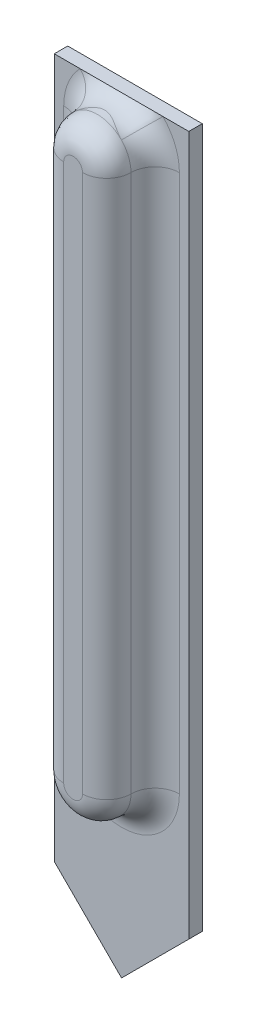
ISO-10303-21;
HEADER;
FILE_DESCRIPTION(('STEP AP214'),'2;1');
FILE_NAME('part.step','',(''),(''),'','','');
FILE_SCHEMA(('AUTOMOTIVE_DESIGN { 1 0 10303 214 1 1 1 1 }'));
ENDSEC;
DATA;
#1=APPLICATION_CONTEXT('core data for automotive mechanical design processes');
#2=APPLICATION_PROTOCOL_DEFINITION('international standard','automotive_design',2000,#1);
#3=PRODUCT_CONTEXT('',#1,'mechanical');
#4=PRODUCT('Part','Part','',(#3));
#5=PRODUCT_RELATED_PRODUCT_CATEGORY('part','',(#4));
#6=PRODUCT_DEFINITION_FORMATION('','',#4);
#7=PRODUCT_DEFINITION_CONTEXT('part definition',#1,'design');
#8=PRODUCT_DEFINITION('design','',#6,#7);
#9=PRODUCT_DEFINITION_SHAPE('','',#8);
#10=(LENGTH_UNIT() NAMED_UNIT(*) SI_UNIT(.MILLI.,.METRE.));
#11=(NAMED_UNIT(*) PLANE_ANGLE_UNIT() SI_UNIT($,.RADIAN.));
#12=(NAMED_UNIT(*) SI_UNIT($,.STERADIAN.) SOLID_ANGLE_UNIT());
#13=UNCERTAINTY_MEASURE_WITH_UNIT(LENGTH_MEASURE(1.E-05),#10,'distance_accuracy_value','');
#14=(GEOMETRIC_REPRESENTATION_CONTEXT(3) GLOBAL_UNCERTAINTY_ASSIGNED_CONTEXT((#13)) GLOBAL_UNIT_ASSIGNED_CONTEXT((#10,
#11,#12)) REPRESENTATION_CONTEXT('',''));
#15=CARTESIAN_POINT('',(0.,0.,0.));
#16=DIRECTION('',(0.,0.,1.));
#17=DIRECTION('',(1.,0.,0.));
#18=AXIS2_PLACEMENT_3D('',#15,#16,#17);
#19=CARTESIAN_POINT('',(0.,5.4,0.46));
#20=DIRECTION('',(0.,0.,1.));
#21=DIRECTION('',(1.,0.,0.));
#22=AXIS2_PLACEMENT_3D('',#19,#20,#21);
#23=PLANE('',#22);
#24=DIRECTION('',(0.,-1.,0.));
#25=VECTOR('',#24,1.);
#26=CARTESIAN_POINT('',(0.0699999999999997,5.4,0.46));
#27=LINE('',#26,#25);
#28=CARTESIAN_POINT('',(0.0700000000000002,5.4,0.46));
#29=VERTEX_POINT('',#28);
#30=CARTESIAN_POINT('',(0.07,1.4,0.46));
#31=VERTEX_POINT('',#30);
#32=EDGE_CURVE('E190',#29,#31,#27,.T.);
#33=ORIENTED_EDGE('',*,*,#32,.F.);
#34=CARTESIAN_POINT('',(0.,5.4,0.46));
#35=DIRECTION('',(0.,0.,-1.));
#36=DIRECTION('',(-1.,0.,0.));
#37=AXIS2_PLACEMENT_3D('',#34,#35,#36);
#38=CIRCLE('',#37,0.0700000000000015);
#39=CARTESIAN_POINT('',(-0.070000000000002,5.4,0.46));
#40=VERTEX_POINT('',#39);
#41=EDGE_CURVE('E176',#40,#29,#38,.T.);
#42=ORIENTED_EDGE('',*,*,#41,.F.);
#43=DIRECTION('',(0.,1.,0.));
#44=VECTOR('',#43,1.);
#45=CARTESIAN_POINT('',(-0.0700000000000034,5.4,0.46));
#46=LINE('',#45,#44);
#47=CARTESIAN_POINT('',(-0.0700000000000008,1.4,0.46));
#48=VERTEX_POINT('',#47);
#49=EDGE_CURVE('E172',#48,#40,#46,.T.);
#50=ORIENTED_EDGE('',*,*,#49,.F.);
#51=CARTESIAN_POINT('',(0.,1.4,0.46));
#52=DIRECTION('',(0.,0.,-1.));
#53=DIRECTION('',(1.,0.,0.));
#54=AXIS2_PLACEMENT_3D('',#51,#52,#53);
#55=CIRCLE('',#54,0.0699999999999999);
#56=EDGE_CURVE('E159',#48,#31,#55,.F.);
#57=ORIENTED_EDGE('',*,*,#56,.T.);
#58=EDGE_LOOP('',(#33,#42,#50,#57));
#59=FACE_BOUND('',#58,.T.);
#60=ADVANCED_FACE('F16',(#59),#23,.T.);
#61=CARTESIAN_POINT('',(-0.0700000000000034,5.4,0.28));
#62=DIRECTION('',(0.,1.,0.));
#63=DIRECTION('',(-1.,0.,0.));
#64=AXIS2_PLACEMENT_3D('',#61,#62,#63);
#65=CYLINDRICAL_SURFACE('',#64,0.18);
#66=DIRECTION('',(0.,-1.,0.));
#67=VECTOR('',#66,1.);
#68=CARTESIAN_POINT('',(-0.250000000000001,0.,0.28));
#69=LINE('',#68,#67);
#70=CARTESIAN_POINT('',(-0.250000000000002,5.4,0.28));
#71=VERTEX_POINT('',#70);
#72=CARTESIAN_POINT('',(-0.250000000000001,1.4,0.28));
#73=VERTEX_POINT('',#72);
#74=EDGE_CURVE('E184',#71,#73,#69,.T.);
#75=ORIENTED_EDGE('',*,*,#74,.T.);
#76=CARTESIAN_POINT('',(-0.0700000000000007,1.4,0.28));
#77=DIRECTION('',(0.,-1.,0.));
#78=DIRECTION('',(-1.,0.,0.));
#79=AXIS2_PLACEMENT_3D('',#76,#77,#78);
#80=CIRCLE('',#79,0.18);
#81=EDGE_CURVE('E169',#48,#73,#80,.T.);
#82=ORIENTED_EDGE('',*,*,#81,.F.);
#83=ORIENTED_EDGE('',*,*,#49,.T.);
#84=CARTESIAN_POINT('',(-0.0700000000000015,5.4,0.28));
#85=DIRECTION('',(0.,-1.,0.));
#86=DIRECTION('',(-1.,0.,0.));
#87=AXIS2_PLACEMENT_3D('',#84,#85,#86);
#88=CIRCLE('',#87,0.18);
#89=EDGE_CURVE('E180',#71,#40,#88,.F.);
#90=ORIENTED_EDGE('',*,*,#89,.F.);
#91=EDGE_LOOP('',(#75,#82,#83,#90));
#92=FACE_BOUND('',#91,.T.);
#93=ADVANCED_FACE('F182',(#92),#65,.T.);
#94=CARTESIAN_POINT('',(0.0700000000000015,5.4,0.28));
#95=DIRECTION('',(0.,1.,0.));
#96=DIRECTION('',(1.,0.,0.));
#97=AXIS2_PLACEMENT_3D('',#94,#95,#96);
#98=CIRCLE('',#97,0.18);
#99=TRIMMED_CURVE('',#98,(PARAMETER_VALUE(-1.9702215666755)),(PARAMETER_VALUE(1.9702215666755)),
.T.,.PARAMETER.);
#100=CARTESIAN_POINT('',(0.,5.4,0.28));
#101=DIRECTION('',(0.,0.,1.));
#102=AXIS1_PLACEMENT('',#100,#101);
#103=SURFACE_OF_REVOLUTION('',#99,#102);
#104=ORIENTED_EDGE('',*,*,#41,.T.);
#105=CARTESIAN_POINT('',(0.0699999999999997,5.4,0.28));
#106=DIRECTION('',(0.,-1.,0.));
#107=DIRECTION('',(1.,0.,0.));
#108=AXIS2_PLACEMENT_3D('',#105,#106,#107);
#109=CIRCLE('',#108,0.18);
#110=CARTESIAN_POINT('',(0.25,5.4,0.28));
#111=VERTEX_POINT('',#110);
#112=EDGE_CURVE('E201',#111,#29,#109,.T.);
#113=ORIENTED_EDGE('',*,*,#112,.F.);
#114=CARTESIAN_POINT('',(0.,5.4,0.28));
#115=DIRECTION('',(0.,0.,1.));
#116=DIRECTION('',(1.,0.,0.));
#117=AXIS2_PLACEMENT_3D('',#114,#115,#116);
#118=CIRCLE('',#117,0.250000000000001);
#119=CARTESIAN_POINT('',(0.179103741869174,5.57441860465117,0.28));
#120=VERTEX_POINT('',#119);
#121=EDGE_CURVE('E252',#111,#120,#118,.T.);
#122=ORIENTED_EDGE('',*,*,#121,.T.);
#123=CARTESIAN_POINT('',(0.,5.4,0.28));
#124=DIRECTION('',(0.,0.,-1.));
#125=DIRECTION('',(-1.,0.,0.));
#126=AXIS2_PLACEMENT_3D('',#123,#124,#125);
#127=CIRCLE('',#126,0.250000000000001);
#128=CARTESIAN_POINT('',(-0.17910374186918,5.57441860465116,0.28));
#129=VERTEX_POINT('',#128);
#130=EDGE_CURVE('E186',#129,#120,#127,.T.);
#131=ORIENTED_EDGE('',*,*,#130,.F.);
#132=CARTESIAN_POINT('',(0.,5.4,0.28));
#133=DIRECTION('',(0.,0.,1.));
#134=DIRECTION('',(1.,0.,0.));
#135=AXIS2_PLACEMENT_3D('',#132,#133,#134);
#136=CIRCLE('',#135,0.250000000000001);
#137=EDGE_CURVE('E198',#129,#71,#136,.T.);
#138=ORIENTED_EDGE('',*,*,#137,.T.);
#139=ORIENTED_EDGE('',*,*,#89,.T.);
#140=EDGE_LOOP('',(#104,#113,#122,#131,#138,#139));
#141=FACE_BOUND('',#140,.T.);
#142=ADVANCED_FACE('F210',(#141),#103,.F.);
#143=CARTESIAN_POINT('',(0.0699999999999997,5.4,0.28));
#144=DIRECTION('',(0.,-1.,0.));
#145=DIRECTION('',(1.,0.,0.));
#146=AXIS2_PLACEMENT_3D('',#143,#144,#145);
#147=CYLINDRICAL_SURFACE('',#146,0.18);
#148=ORIENTED_EDGE('',*,*,#32,.T.);
#149=CARTESIAN_POINT('',(0.0700000000000007,1.4,0.28));
#150=DIRECTION('',(0.,1.,0.));
#151=DIRECTION('',(1.,0.,0.));
#152=AXIS2_PLACEMENT_3D('',#149,#150,#151);
#153=CIRCLE('',#152,0.18);
#154=CARTESIAN_POINT('',(0.25,1.4,0.28));
#155=VERTEX_POINT('',#154);
#156=EDGE_CURVE('E171',#155,#31,#153,.F.);
#157=ORIENTED_EDGE('',*,*,#156,.F.);
#158=DIRECTION('',(0.,1.,0.));
#159=VECTOR('',#158,1.);
#160=CARTESIAN_POINT('',(0.25,0.,0.28));
#161=LINE('',#160,#159);
#162=EDGE_CURVE('E250',#155,#111,#161,.T.);
#163=ORIENTED_EDGE('',*,*,#162,.T.);
#164=ORIENTED_EDGE('',*,*,#112,.T.);
#165=EDGE_LOOP('',(#148,#157,#163,#164));
#166=FACE_BOUND('',#165,.T.);
#167=ADVANCED_FACE('F214',(#166),#147,.T.);
#168=CARTESIAN_POINT('',(0.0700000000000007,1.4,0.28));
#169=DIRECTION('',(0.,1.,0.));
#170=DIRECTION('',(1.,0.,0.));
#171=AXIS2_PLACEMENT_3D('',#168,#169,#170);
#172=CIRCLE('',#171,0.18);
#173=TRIMMED_CURVE('',#172,(PARAMETER_VALUE(-1.9702215666755)),
(PARAMETER_VALUE(1.9702215666755)),.T.,.PARAMETER.);
#174=CARTESIAN_POINT('',(0.,1.4,0.28));
#175=DIRECTION('',(0.,0.,1.));
#176=AXIS1_PLACEMENT('',#174,#175);
#177=SURFACE_OF_REVOLUTION('',#173,#176);
#178=ORIENTED_EDGE('',*,*,#81,.T.);
#179=CARTESIAN_POINT('',(0.,1.4,0.28));
#180=DIRECTION('',(0.,0.,1.));
#181=DIRECTION('',(1.,0.,0.));
#182=AXIS2_PLACEMENT_3D('',#179,#180,#181);
#183=CIRCLE('',#182,0.250000000000001);
#184=EDGE_CURVE('E339',#73,#155,#183,.T.);
#185=ORIENTED_EDGE('',*,*,#184,.T.);
#186=ORIENTED_EDGE('',*,*,#156,.T.);
#187=ORIENTED_EDGE('',*,*,#56,.F.);
#188=EDGE_LOOP('',(#178,#185,#186,#187));
#189=FACE_BOUND('',#188,.T.);
#190=ADVANCED_FACE('F166',(#189),#177,.F.);
#191=CARTESIAN_POINT('',(0.,5.4,0.46));
#192=DIRECTION('',(0.,0.,-1.));
#193=DIRECTION('',(-1.,0.,0.));
#194=AXIS2_PLACEMENT_3D('',#191,#192,#193);
#195=CYLINDRICAL_SURFACE('',#194,0.250000000000001);
#196=ORIENTED_EDGE('',*,*,#130,.T.);
#197=CARTESIAN_POINT('',(-0.17910374186918,5.57441860465116,0.28));
#198=CARTESIAN_POINT('',(-0.155346806167557,5.59881368617367,0.27999954022219));
#199=CARTESIAN_POINT('',(-0.127244302039456,5.61765410443162,0.265939195851083));
#200=CARTESIAN_POINT('',(-0.0671254923551522,5.64301973140779,0.238360025353106));
#201=CARTESIAN_POINT('',(-0.0341213276340786,5.64999369309407,0.224510284251947));
#202=CARTESIAN_POINT('',(0.0340288461470066,5.65000629835311,0.224487723068687));
#203=CARTESIAN_POINT('',(0.0671266285470243,5.64302527002861,0.238359706539339));
#204=CARTESIAN_POINT('',(0.127321400700701,5.61761554874636,0.265975405936455));
#205=CARTESIAN_POINT('',(0.155388089068925,5.59877129435356,0.279999554675328));
#206=CARTESIAN_POINT('',(0.179103741869169,5.57441860465117,0.28));
#207=(BOUNDED_CURVE() B_SPLINE_CURVE(3,(#197,#198,#199,#200,#201,#202,#203,#204,#205,#206),
.UNSPECIFIED.,.F.,.F.) B_SPLINE_CURVE_WITH_KNOTS((4,2,2,2,4),(0.000308529946334535,
0.000483123963909765,0.000657717981484994,0.000832311999060223,0.00100690601663545),
.UNSPECIFIED.) CURVE() GEOMETRIC_REPRESENTATION_ITEM() RATIONAL_B_SPLINE_CURVE((1.,1.,1.,1.,1.,
1.,1.,1.,1.,1.)) REPRESENTATION_ITEM(''));
#208=EDGE_CURVE('E263',#120,#129,#207,.F.);
#209=ORIENTED_EDGE('',*,*,#208,.T.);
#210=EDGE_LOOP('',(#196,#209));
#211=FACE_BOUND('',#210,.T.);
#212=ADVANCED_FACE('F261',(#211),#195,.T.);
#213=CARTESIAN_POINT('',(-0.430000000000001,0.,0.28));
#214=DIRECTION('',(0.,-1.,0.));
#215=DIRECTION('',(1.,0.,0.));
#216=AXIS2_PLACEMENT_3D('',#213,#214,#215);
#217=CYLINDRICAL_SURFACE('',#216,0.18);
#218=DIRECTION('',(0.,1.,0.));
#219=VECTOR('',#218,1.);
#220=CARTESIAN_POINT('',(-0.430000000000001,0.,0.1));
#221=LINE('',#220,#219);
#222=CARTESIAN_POINT('',(-0.430000000000001,1.4,0.1));
#223=VERTEX_POINT('',#222);
#224=CARTESIAN_POINT('',(-0.430000000000003,5.4,0.1));
#225=VERTEX_POINT('',#224);
#226=EDGE_CURVE('E276',#223,#225,#221,.T.);
#227=ORIENTED_EDGE('',*,*,#226,.F.);
#228=CARTESIAN_POINT('',(-0.430000000000001,1.4,0.28));
#229=DIRECTION('',(0.,-1.,0.));
#230=DIRECTION('',(-1.,0.,0.));
#231=AXIS2_PLACEMENT_3D('',#228,#229,#230);
#232=CIRCLE('',#231,0.18);
#233=EDGE_CURVE('E342',#223,#73,#232,.T.);
#234=ORIENTED_EDGE('',*,*,#233,.T.);
#235=ORIENTED_EDGE('',*,*,#74,.F.);
#236=CARTESIAN_POINT('',(-0.430000000000001,5.4,0.28));
#237=DIRECTION('',(0.,-1.,0.));
#238=DIRECTION('',(-1.,0.,0.));
#239=AXIS2_PLACEMENT_3D('',#236,#237,#238);
#240=CIRCLE('',#239,0.18);
#241=EDGE_CURVE('E258',#71,#225,#240,.F.);
#242=ORIENTED_EDGE('',*,*,#241,.T.);
#243=EDGE_LOOP('',(#227,#234,#235,#242));
#244=FACE_BOUND('',#243,.T.);
#245=ADVANCED_FACE('F401',(#244),#217,.F.);
#246=CARTESIAN_POINT('',(0.,5.4,0.28));
#247=DIRECTION('',(0.,0.,1.));
#248=DIRECTION('',(1.,0.,0.));
#249=AXIS2_PLACEMENT_3D('',#246,#247,#248);
#250=TOROIDAL_SURFACE('',#249,0.430000000000001,0.18);
#251=CARTESIAN_POINT('',(0.,5.4,0.1));
#252=DIRECTION('',(0.,0.,1.));
#253=DIRECTION('',(-0.716414967476717,0.697674418604649,0.));
#254=AXIS2_PLACEMENT_3D('',#251,#252,#253);
#255=CIRCLE('',#254,0.430000000000002);
#256=CARTESIAN_POINT('',(-0.308058436014989,5.7,0.1));
#257=VERTEX_POINT('',#256);
#258=EDGE_CURVE('E373',#225,#257,#255,.F.);
#259=ORIENTED_EDGE('',*,*,#258,.F.);
#260=ORIENTED_EDGE('',*,*,#241,.F.);
#261=ORIENTED_EDGE('',*,*,#137,.F.);
#262=CARTESIAN_POINT('',(-0.308058436014988,5.7,0.28));
#263=DIRECTION('',(0.697674418604654,0.716414967476712,0.));
#264=DIRECTION('',(0.716414967476713,-0.697674418604653,0.));
#265=AXIS2_PLACEMENT_3D('',#262,#263,#264);
#266=CIRCLE('',#265,0.18);
#267=EDGE_CURVE('E277',#129,#257,#266,.T.);
#268=ORIENTED_EDGE('',*,*,#267,.T.);
#269=EDGE_LOOP('',(#259,#260,#261,#268));
#270=FACE_BOUND('',#269,.T.);
#271=ADVANCED_FACE('F355',(#270),#250,.F.);
#272=CARTESIAN_POINT('',(0.,5.4,0.28));
#273=DIRECTION('',(0.,0.,1.));
#274=DIRECTION('',(1.,0.,0.));
#275=AXIS2_PLACEMENT_3D('',#272,#273,#274);
#276=TOROIDAL_SURFACE('',#275,0.430000000000001,0.18);
#277=CARTESIAN_POINT('',(0.,5.4,0.1));
#278=DIRECTION('',(0.,0.,1.));
#279=DIRECTION('',(1.,0.,0.));
#280=AXIS2_PLACEMENT_3D('',#277,#278,#279);
#281=CIRCLE('',#280,0.430000000000002);
#282=CARTESIAN_POINT('',(0.308058436014987,5.7,0.0999999999999999));
#283=VERTEX_POINT('',#282);
#284=CARTESIAN_POINT('',(0.43,5.4,0.1));
#285=VERTEX_POINT('',#284);
#286=EDGE_CURVE('E270',#283,#285,#281,.F.);
#287=ORIENTED_EDGE('',*,*,#286,.F.);
#288=CARTESIAN_POINT('',(0.30805843601497,5.70000000000002,0.28));
#289=DIRECTION('',(-0.697674418604699,0.716414967476668,0.));
#290=DIRECTION('',(-0.716414967476668,-0.697674418604699,0.));
#291=AXIS2_PLACEMENT_3D('',#288,#289,#290);
#292=CIRCLE('',#291,0.18);
#293=EDGE_CURVE('E267',#283,#120,#292,.T.);
#294=ORIENTED_EDGE('',*,*,#293,.T.);
#295=ORIENTED_EDGE('',*,*,#121,.F.);
#296=CARTESIAN_POINT('',(0.43,5.4,0.28));
#297=DIRECTION('',(0.,1.,0.));
#298=DIRECTION('',(-1.,0.,0.));
#299=AXIS2_PLACEMENT_3D('',#296,#297,#298);
#300=CIRCLE('',#299,0.18);
#301=EDGE_CURVE('E344',#111,#285,#300,.F.);
#302=ORIENTED_EDGE('',*,*,#301,.T.);
#303=EDGE_LOOP('',(#287,#294,#295,#302));
#304=FACE_BOUND('',#303,.T.);
#305=ADVANCED_FACE('F268',(#304),#276,.F.);
#306=CARTESIAN_POINT('',(0.43,0.,0.28));
#307=DIRECTION('',(0.,1.,0.));
#308=DIRECTION('',(-1.,0.,0.));
#309=AXIS2_PLACEMENT_3D('',#306,#307,#308);
#310=CYLINDRICAL_SURFACE('',#309,0.18);
#311=ORIENTED_EDGE('',*,*,#162,.F.);
#312=CARTESIAN_POINT('',(0.430000000000001,1.4,0.28));
#313=DIRECTION('',(0.,1.,0.));
#314=DIRECTION('',(1.,0.,0.));
#315=AXIS2_PLACEMENT_3D('',#312,#313,#314);
#316=CIRCLE('',#315,0.18);
#317=CARTESIAN_POINT('',(0.430000000000001,1.4,0.1));
#318=VERTEX_POINT('',#317);
#319=EDGE_CURVE('E282',#155,#318,#316,.F.);
#320=ORIENTED_EDGE('',*,*,#319,.T.);
#321=DIRECTION('',(0.,1.,0.));
#322=VECTOR('',#321,1.);
#323=CARTESIAN_POINT('',(0.43,0.,0.1));
#324=LINE('',#323,#322);
#325=EDGE_CURVE('E412',#285,#318,#324,.F.);
#326=ORIENTED_EDGE('',*,*,#325,.F.);
#327=ORIENTED_EDGE('',*,*,#301,.F.);
#328=EDGE_LOOP('',(#311,#320,#326,#327));
#329=FACE_BOUND('',#328,.T.);
#330=ADVANCED_FACE('F315',(#329),#310,.F.);
#331=CARTESIAN_POINT('',(0.,1.4,0.28));
#332=DIRECTION('',(0.,0.,1.));
#333=DIRECTION('',(1.,0.,0.));
#334=AXIS2_PLACEMENT_3D('',#331,#332,#333);
#335=TOROIDAL_SURFACE('',#334,0.430000000000001,0.18);
#336=ORIENTED_EDGE('',*,*,#184,.F.);
#337=ORIENTED_EDGE('',*,*,#233,.F.);
#338=CARTESIAN_POINT('',(0.,1.4,0.1));
#339=DIRECTION('',(0.,0.,1.));
#340=DIRECTION('',(-1.,0.,0.));
#341=AXIS2_PLACEMENT_3D('',#338,#339,#340);
#342=CIRCLE('',#341,0.430000000000001);
#343=EDGE_CURVE('E328',#318,#223,#342,.F.);
#344=ORIENTED_EDGE('',*,*,#343,.F.);
#345=ORIENTED_EDGE('',*,*,#319,.F.);
#346=EDGE_LOOP('',(#336,#337,#344,#345));
#347=FACE_BOUND('',#346,.T.);
#348=ADVANCED_FACE('F303',(#347),#335,.F.);
#349=CARTESIAN_POINT('',(0.179103741869169,5.57441860465117,0.28));
#350=CARTESIAN_POINT('',(0.179103741869179,5.57441860465116,0.100000000000014));
#351=CARTESIAN_POINT('',(0.30805843601497,5.7,0.1));
#352=CARTESIAN_POINT('',(0.155388089068925,5.59877129435356,0.279999554675328));
#353=CARTESIAN_POINT('',(0.1764137469796,5.57718207811373,0.128281540501433));
#354=CARTESIAN_POINT('',(0.267271783992285,5.7,0.1));
#355=CARTESIAN_POINT('',(0.127321400700701,5.61761554874636,0.265975405936455));
#356=CARTESIAN_POINT('',(0.154791727221271,5.60229152599031,0.144999845657445));
#357=CARTESIAN_POINT('',(0.218992810851991,5.7,0.100000000000001));
#358=CARTESIAN_POINT('',(0.0671266285470243,5.64302527002861,0.238359706539339));
#359=CARTESIAN_POINT('',(0.0889000534710502,5.63723045237553,0.154912521513229));
#360=CARTESIAN_POINT('',(0.115457799454096,5.7,0.0999999999999994));
#361=CARTESIAN_POINT('',(0.0340288461470066,5.65000629835311,0.224487723068687));
#362=CARTESIAN_POINT('',(0.0443022846662579,5.65001006690792,0.152207807841712));
#363=CARTESIAN_POINT('',(0.058529615379709,5.7,0.1));
#364=CARTESIAN_POINT('',(-0.0341213276340786,5.64999369309407,0.224510284251947));
#365=CARTESIAN_POINT('',(-0.0444247030658912,5.64998991891724,0.152210706955469));
#366=CARTESIAN_POINT('',(-0.058688683537473,5.7,0.1));
#367=CARTESIAN_POINT('',(-0.0671254923551522,5.64301973140779,0.238360025353106));
#368=CARTESIAN_POINT('',(-0.0888886736979652,5.63722831075006,0.154906029912478));
#369=CARTESIAN_POINT('',(-0.115455846078706,5.7,0.0999999999999994));
#370=CARTESIAN_POINT('',(-0.127244302039456,5.61765410443162,0.265939195851083));
#371=CARTESIAN_POINT('',(-0.154708984781072,5.6023443616075,0.145021284807547));
#372=CARTESIAN_POINT('',(-0.218860200280019,5.7,0.1));
#373=CARTESIAN_POINT('',(-0.155346806167557,5.59881368617367,0.27999954022219));
#374=CARTESIAN_POINT('',(-0.176408857335257,5.57718710782864,0.128332758834526));
#375=CARTESIAN_POINT('',(-0.267206351406332,5.7,0.1));
#376=CARTESIAN_POINT('',(-0.17910374186918,5.57441860465116,0.28));
#377=CARTESIAN_POINT('',(-0.17910374186918,5.57441860465116,0.100000000000001));
#378=CARTESIAN_POINT('',(-0.308058436014988,5.7,0.1));
#379=(BOUNDED_SURFACE() B_SPLINE_SURFACE(3,2,((#349,#350,#351),(#352,#353,#354),(#355,#356,
#357),(#358,#359,#360),(#361,#362,#363),(#364,#365,#366),(#367,#368,#369),(#370,#371,#372),
(#373,#374,#375),(#376,#377,#378)),.UNSPECIFIED.,.F.,.F.,.F.) B_SPLINE_SURFACE_WITH_KNOTS((4,2,
2,2,4),(3,3),(0.000308529946334535,0.000483123963909765,0.000657717981484994,
0.000832311999060223,0.00100690601663545),(0.,1.),
.UNSPECIFIED.) GEOMETRIC_REPRESENTATION_ITEM() RATIONAL_B_SPLINE_SURFACE(((1.,0.707106781186575,
1.),(1.,0.765345006797525,1.),(1.,0.823519548796732,1.),(1.,0.903977827565001,1.),(1.,
0.927981770905569,1.),(1.,0.927939654696627,1.),(1.,0.903962496694066,1.),(1.,0.823639429235469,
1.),(1.,0.765459439863177,1.),(1.,0.707106781186549,1.))) REPRESENTATION_ITEM('') SURFACE());
#380=DIRECTION('',(1.,0.,0.));
#381=VECTOR('',#380,1.);
#382=CARTESIAN_POINT('',(0.,5.7,0.1));
#383=LINE('',#382,#381);
#384=EDGE_CURVE('E445',#283,#257,#383,.F.);
#385=ORIENTED_EDGE('',*,*,#384,.T.);
#386=ORIENTED_EDGE('',*,*,#267,.F.);
#387=ORIENTED_EDGE('',*,*,#208,.F.);
#388=ORIENTED_EDGE('',*,*,#293,.F.);
#389=EDGE_LOOP('',(#385,#386,#387,#388));
#390=FACE_BOUND('',#389,.T.);
#391=ADVANCED_FACE('F281',(#390),#379,.F.);
#392=CARTESIAN_POINT('',(0.,0.,0.1));
#393=DIRECTION('',(0.,0.,1.));
#394=DIRECTION('',(1.,0.,0.));
#395=AXIS2_PLACEMENT_3D('',#392,#393,#394);
#396=PLANE('',#395);
#397=ORIENTED_EDGE('',*,*,#325,.T.);
#398=ORIENTED_EDGE('',*,*,#343,.T.);
#399=ORIENTED_EDGE('',*,*,#226,.T.);
#400=ORIENTED_EDGE('',*,*,#258,.T.);
#401=DIRECTION('',(1.,0.,0.));
#402=VECTOR('',#401,1.);
#403=CARTESIAN_POINT('',(0.,5.7,0.1));
#404=LINE('',#403,#402);
#405=CARTESIAN_POINT('',(-0.499999999999994,5.7,0.1));
#406=VERTEX_POINT('',#405);
#407=EDGE_CURVE('E447',#257,#406,#404,.F.);
#408=ORIENTED_EDGE('',*,*,#407,.T.);
#409=DIRECTION('',(0.,1.,0.));
#410=VECTOR('',#409,1.);
#411=CARTESIAN_POINT('',(-0.499999999999993,0.,0.1));
#412=LINE('',#411,#410);
#413=CARTESIAN_POINT('',(-0.499999999999993,0.499999999999995,0.1));
#414=VERTEX_POINT('',#413);
#415=EDGE_CURVE('E456',#406,#414,#412,.F.);
#416=ORIENTED_EDGE('',*,*,#415,.T.);
#417=DIRECTION('',(-0.707106781186546,0.707106781186549,0.));
#418=VECTOR('',#417,1.);
#419=CARTESIAN_POINT('',(0.,0.,0.1));
#420=LINE('',#419,#418);
#421=CARTESIAN_POINT('',(0.,0.,0.1));
#422=VERTEX_POINT('',#421);
#423=EDGE_CURVE('E600',#414,#422,#420,.F.);
#424=ORIENTED_EDGE('',*,*,#423,.T.);
#425=DIRECTION('',(-0.707106781186546,-0.707106781186549,0.));
#426=VECTOR('',#425,1.);
#427=CARTESIAN_POINT('',(0.,0.,0.1));
#428=LINE('',#427,#426);
#429=CARTESIAN_POINT('',(0.499999999999994,0.499999999999996,0.1));
#430=VERTEX_POINT('',#429);
#431=EDGE_CURVE('E603',#422,#430,#428,.F.);
#432=ORIENTED_EDGE('',*,*,#431,.T.);
#433=DIRECTION('',(0.,1.,0.));
#434=VECTOR('',#433,1.);
#435=CARTESIAN_POINT('',(0.499999999999994,0.,0.1));
#436=LINE('',#435,#434);
#437=CARTESIAN_POINT('',(0.499999999999994,5.7,0.1));
#438=VERTEX_POINT('',#437);
#439=EDGE_CURVE('E472',#430,#438,#436,.T.);
#440=ORIENTED_EDGE('',*,*,#439,.T.);
#441=DIRECTION('',(1.,0.,0.));
#442=VECTOR('',#441,1.);
#443=CARTESIAN_POINT('',(0.,5.7,0.1));
#444=LINE('',#443,#442);
#445=EDGE_CURVE('E417',#438,#283,#444,.F.);
#446=ORIENTED_EDGE('',*,*,#445,.T.);
#447=ORIENTED_EDGE('',*,*,#286,.T.);
#448=EDGE_LOOP('',(#397,#398,#399,#400,#408,#416,#424,#432,#440,#446,#447));
#449=FACE_BOUND('',#448,.T.);
#450=ADVANCED_FACE('F302',(#449),#396,.T.);
#451=CARTESIAN_POINT('',(-0.0700000000000034,5.4,0.28));
#452=DIRECTION('',(0.,1.,0.));
#453=DIRECTION('',(-1.,0.,0.));
#454=AXIS2_PLACEMENT_3D('',#451,#452,#453);
#455=CYLINDRICAL_SURFACE('',#454,0.08);
#456=CARTESIAN_POINT('',(-0.0700000000000015,1.4,0.28));
#457=DIRECTION('',(0.,1.,0.));
#458=DIRECTION('',(-1.,0.,0.));
#459=AXIS2_PLACEMENT_3D('',#456,#457,#458);
#460=CIRCLE('',#459,0.08);
#461=CARTESIAN_POINT('',(-0.150000000000001,1.4,0.28));
#462=VERTEX_POINT('',#461);
#463=CARTESIAN_POINT('',(-0.0700000000000012,1.4,0.36));
#464=VERTEX_POINT('',#463);
#465=EDGE_CURVE('E469',#462,#464,#460,.T.);
#466=ORIENTED_EDGE('',*,*,#465,.F.);
#467=DIRECTION('',(0.,-1.,0.));
#468=VECTOR('',#467,1.);
#469=CARTESIAN_POINT('',(-0.150000000000001,0.,0.28));
#470=LINE('',#469,#468);
#471=CARTESIAN_POINT('',(-0.150000000000002,5.4,0.28));
#472=VERTEX_POINT('',#471);
#473=EDGE_CURVE('E477',#472,#462,#470,.T.);
#474=ORIENTED_EDGE('',*,*,#473,.F.);
#475=CARTESIAN_POINT('',(-0.0700000000000015,5.4,0.28));
#476=DIRECTION('',(0.,-1.,0.));
#477=DIRECTION('',(-1.,0.,0.));
#478=AXIS2_PLACEMENT_3D('',#475,#476,#477);
#479=CIRCLE('',#478,0.08);
#480=CARTESIAN_POINT('',(-0.0700000000000015,5.4,0.36));
#481=VERTEX_POINT('',#480);
#482=EDGE_CURVE('E486',#472,#481,#479,.F.);
#483=ORIENTED_EDGE('',*,*,#482,.T.);
#484=DIRECTION('',(0.,1.,0.));
#485=VECTOR('',#484,1.);
#486=CARTESIAN_POINT('',(-0.0700000000000015,5.4,0.36));
#487=LINE('',#486,#485);
#488=EDGE_CURVE('E544',#481,#464,#487,.F.);
#489=ORIENTED_EDGE('',*,*,#488,.T.);
#490=EDGE_LOOP('',(#466,#474,#483,#489));
#491=FACE_BOUND('',#490,.T.);
#492=ADVANCED_FACE('F750',(#491),#455,.F.);
#493=CARTESIAN_POINT('',(0.,5.7,0.1));
#494=DIRECTION('',(0.,-1.,0.));
#495=DIRECTION('',(0.,0.,-1.));
#496=AXIS2_PLACEMENT_3D('',#493,#494,#495);
#497=PLANE('',#496);
#498=DIRECTION('',(0.,0.,1.));
#499=VECTOR('',#498,1.);
#500=CARTESIAN_POINT('',(-0.499999999999994,5.7,0.1));
#501=LINE('',#500,#499);
#502=CARTESIAN_POINT('',(-0.499999999999994,5.7,0.));
#503=VERTEX_POINT('',#502);
#504=EDGE_CURVE('E451',#503,#406,#501,.T.);
#505=ORIENTED_EDGE('',*,*,#504,.T.);
#506=ORIENTED_EDGE('',*,*,#407,.F.);
#507=ORIENTED_EDGE('',*,*,#384,.F.);
#508=ORIENTED_EDGE('',*,*,#445,.F.);
#509=DIRECTION('',(0.,0.,1.));
#510=VECTOR('',#509,1.);
#511=CARTESIAN_POINT('',(0.499999999999994,5.7,0.1));
#512=LINE('',#511,#510);
#513=CARTESIAN_POINT('',(0.499999999999994,5.7,0.));
#514=VERTEX_POINT('',#513);
#515=EDGE_CURVE('E474',#438,#514,#512,.F.);
#516=ORIENTED_EDGE('',*,*,#515,.T.);
#517=DIRECTION('',(1.,0.,0.));
#518=VECTOR('',#517,1.);
#519=CARTESIAN_POINT('',(0.,5.7,0.));
#520=LINE('',#519,#518);
#521=EDGE_CURVE('E593',#514,#503,#520,.F.);
#522=ORIENTED_EDGE('',*,*,#521,.T.);
#523=EDGE_LOOP('',(#505,#506,#507,#508,#516,#522));
#524=FACE_BOUND('',#523,.T.);
#525=ADVANCED_FACE('F589',(#524),#497,.F.);
#526=CARTESIAN_POINT('',(-0.499999999999993,0.,0.1));
#527=DIRECTION('',(1.,0.,0.));
#528=DIRECTION('',(0.,1.,0.));
#529=AXIS2_PLACEMENT_3D('',#526,#527,#528);
#530=PLANE('',#529);
#531=DIRECTION('',(0.,0.,1.));
#532=VECTOR('',#531,1.);
#533=CARTESIAN_POINT('',(-0.499999999999993,0.499999999999995,0.1));
#534=LINE('',#533,#532);
#535=CARTESIAN_POINT('',(-0.499999999999993,0.499999999999995,0.));
#536=VERTEX_POINT('',#535);
#537=EDGE_CURVE('E460',#536,#414,#534,.T.);
#538=ORIENTED_EDGE('',*,*,#537,.T.);
#539=ORIENTED_EDGE('',*,*,#415,.F.);
#540=ORIENTED_EDGE('',*,*,#504,.F.);
#541=DIRECTION('',(0.,1.,0.));
#542=VECTOR('',#541,1.);
#543=CARTESIAN_POINT('',(-0.499999999999994,0.,0.));
#544=LINE('',#543,#542);
#545=EDGE_CURVE('E719',#503,#536,#544,.F.);
#546=ORIENTED_EDGE('',*,*,#545,.T.);
#547=EDGE_LOOP('',(#538,#539,#540,#546));
#548=FACE_BOUND('',#547,.T.);
#549=ADVANCED_FACE('F597',(#548),#530,.F.);
#550=CARTESIAN_POINT('',(0.,0.,0.1));
#551=DIRECTION('',(0.707106781186549,0.707106781186546,0.));
#552=DIRECTION('',(-0.707106781186546,0.707106781186549,0.));
#553=AXIS2_PLACEMENT_3D('',#550,#551,#552);
#554=PLANE('',#553);
#555=DIRECTION('',(0.,0.,1.));
#556=VECTOR('',#555,1.);
#557=CARTESIAN_POINT('',(0.,0.,0.1));
#558=LINE('',#557,#556);
#559=CARTESIAN_POINT('',(0.,0.,0.));
#560=VERTEX_POINT('',#559);
#561=EDGE_CURVE('E606',#560,#422,#558,.T.);
#562=ORIENTED_EDGE('',*,*,#561,.T.);
#563=ORIENTED_EDGE('',*,*,#423,.F.);
#564=ORIENTED_EDGE('',*,*,#537,.F.);
#565=DIRECTION('',(0.707106781186546,-0.707106781186549,0.));
#566=VECTOR('',#565,1.);
#567=CARTESIAN_POINT('',(-0.499999999999993,0.499999999999995,0.));
#568=LINE('',#567,#566);
#569=EDGE_CURVE('E610',#536,#560,#568,.T.);
#570=ORIENTED_EDGE('',*,*,#569,.T.);
#571=EDGE_LOOP('',(#562,#563,#564,#570));
#572=FACE_BOUND('',#571,.T.);
#573=ADVANCED_FACE('F608',(#572),#554,.F.);
#574=CARTESIAN_POINT('',(0.,0.,0.1));
#575=DIRECTION('',(-0.707106781186549,0.707106781186546,0.));
#576=DIRECTION('',(-0.707106781186546,-0.707106781186549,0.));
#577=AXIS2_PLACEMENT_3D('',#574,#575,#576);
#578=PLANE('',#577);
#579=DIRECTION('',(0.,0.,1.));
#580=VECTOR('',#579,1.);
#581=CARTESIAN_POINT('',(0.499999999999994,0.499999999999996,0.1));
#582=LINE('',#581,#580);
#583=CARTESIAN_POINT('',(0.499999999999994,0.499999999999996,0.));
#584=VERTEX_POINT('',#583);
#585=EDGE_CURVE('E475',#584,#430,#582,.T.);
#586=ORIENTED_EDGE('',*,*,#585,.T.);
#587=ORIENTED_EDGE('',*,*,#431,.F.);
#588=ORIENTED_EDGE('',*,*,#561,.F.);
#589=DIRECTION('',(0.707106781186546,0.707106781186549,0.));
#590=VECTOR('',#589,1.);
#591=CARTESIAN_POINT('',(0.,0.,0.));
#592=LINE('',#591,#590);
#593=EDGE_CURVE('E716',#560,#584,#592,.T.);
#594=ORIENTED_EDGE('',*,*,#593,.T.);
#595=EDGE_LOOP('',(#586,#587,#588,#594));
#596=FACE_BOUND('',#595,.T.);
#597=ADVANCED_FACE('F614',(#596),#578,.F.);
#598=CARTESIAN_POINT('',(0.499999999999994,0.,0.1));
#599=DIRECTION('',(-1.,0.,0.));
#600=DIRECTION('',(0.,0.,1.));
#601=AXIS2_PLACEMENT_3D('',#598,#599,#600);
#602=PLANE('',#601);
#603=ORIENTED_EDGE('',*,*,#515,.F.);
#604=ORIENTED_EDGE('',*,*,#439,.F.);
#605=ORIENTED_EDGE('',*,*,#585,.F.);
#606=DIRECTION('',(0.,1.,0.));
#607=VECTOR('',#606,1.);
#608=CARTESIAN_POINT('',(0.499999999999994,0.,0.));
#609=LINE('',#608,#607);
#610=EDGE_CURVE('E712',#584,#514,#609,.T.);
#611=ORIENTED_EDGE('',*,*,#610,.T.);
#612=EDGE_LOOP('',(#603,#604,#605,#611));
#613=FACE_BOUND('',#612,.T.);
#614=ADVANCED_FACE('F812',(#613),#602,.F.);
#615=CARTESIAN_POINT('',(-0.430000000000001,0.,0.28));
#616=DIRECTION('',(0.,-1.,0.));
#617=DIRECTION('',(1.,0.,0.));
#618=AXIS2_PLACEMENT_3D('',#615,#616,#617);
#619=CYLINDRICAL_SURFACE('',#618,0.28);
#620=CARTESIAN_POINT('',(-0.430000000000001,1.4,0.28));
#621=DIRECTION('',(0.,-1.,0.));
#622=DIRECTION('',(1.,0.,0.));
#623=AXIS2_PLACEMENT_3D('',#620,#621,#622);
#624=CIRCLE('',#623,0.28);
#625=CARTESIAN_POINT('',(-0.430000000000001,1.4,0.));
#626=VERTEX_POINT('',#625);
#627=EDGE_CURVE('E482',#462,#626,#624,.F.);
#628=ORIENTED_EDGE('',*,*,#627,.T.);
#629=DIRECTION('',(0.,1.,0.));
#630=VECTOR('',#629,1.);
#631=CARTESIAN_POINT('',(-0.430000000000001,0.,0.));
#632=LINE('',#631,#630);
#633=CARTESIAN_POINT('',(-0.430000000000003,5.4,0.));
#634=VERTEX_POINT('',#633);
#635=EDGE_CURVE('E710',#626,#634,#632,.T.);
#636=ORIENTED_EDGE('',*,*,#635,.T.);
#637=CARTESIAN_POINT('',(-0.430000000000001,5.4,0.28));
#638=DIRECTION('',(0.,-1.,0.));
#639=DIRECTION('',(-1.,0.,0.));
#640=AXIS2_PLACEMENT_3D('',#637,#638,#639);
#641=CIRCLE('',#640,0.28);
#642=EDGE_CURVE('E624',#472,#634,#641,.F.);
#643=ORIENTED_EDGE('',*,*,#642,.F.);
#644=ORIENTED_EDGE('',*,*,#473,.T.);
#645=EDGE_LOOP('',(#628,#636,#643,#644));
#646=FACE_BOUND('',#645,.T.);
#647=ADVANCED_FACE('F803',(#646),#619,.T.);
#648=CARTESIAN_POINT('',(0.,5.6,0.1));
#649=DIRECTION('',(0.,-1.,0.));
#650=DIRECTION('',(0.,0.,-1.));
#651=AXIS2_PLACEMENT_3D('',#648,#649,#650);
#652=PLANE('',#651);
#653=CARTESIAN_POINT('',(-0.380657326213487,5.6,0.));
#654=CARTESIAN_POINT('',(-0.358577682400129,5.60000000000006,-3.78075804538058E-05));
#655=CARTESIAN_POINT('',(-0.336615424846135,5.60000000000004,0.00203573076146108));
#656=CARTESIAN_POINT('',(-0.293694683205124,5.59999999999997,0.00958258049548286));
#657=CARTESIAN_POINT('',(-0.272725060896618,5.59999999999992,0.0149906520770499));
#658=CARTESIAN_POINT('',(-0.23054083384904,5.59999999999992,0.0288177065712276));
#659=CARTESIAN_POINT('',(-0.209378746416485,5.59999999999998,0.0373888830819809));
#660=CARTESIAN_POINT('',(-0.167759703085659,5.60000000000002,0.0564034531115195));
#661=CARTESIAN_POINT('',(-0.14730934032899,5.6,0.0668606004544956));
#662=CARTESIAN_POINT('',(-0.112883842395289,5.6,0.0844259165928702));
#663=CARTESIAN_POINT('',(-0.0989071504359958,5.60000000000001,0.0915468780422771));
#664=CARTESIAN_POINT('',(-0.0703935946031712,5.59999999999999,0.104550864343724));
#665=CARTESIAN_POINT('',(-0.0558604264850702,5.59999999999997,0.110440792191035));
#666=CARTESIAN_POINT('',(-0.031912788569472,5.60000000000002,0.116954913671424));
#667=CARTESIAN_POINT('',(-0.0228483719999241,5.60000000000006,0.118748321852459));
#668=CARTESIAN_POINT('',(-0.00458011159978979,5.59999999999994,0.120528650853232));
#669=CARTESIAN_POINT('',(0.00462258697472128,5.59999999999977,0.120526218931544));
#670=CARTESIAN_POINT('',(0.0227760249281545,5.59999999999978,0.118753640749292));
#671=CARTESIAN_POINT('',(0.0317280243560716,5.59999999999995,0.116995134279023));
#672=CARTESIAN_POINT('',(0.0493625823546304,5.60000000000005,0.112218428757807));
#673=CARTESIAN_POINT('',(0.0580412920743201,5.59999999999999,0.109187109360021));
#674=CARTESIAN_POINT('',(0.0766556033867202,5.59999999999995,0.101791810363339));
#675=CARTESIAN_POINT('',(0.0865318939295644,5.59999999999999,0.0972856250989097));
#676=CARTESIAN_POINT('',(0.10609024229901,5.60000000000001,0.0878632699444684));
#677=CARTESIAN_POINT('',(0.115772073970221,5.6,0.0829466535067983));
#678=CARTESIAN_POINT('',(0.144844276932296,5.59999999999999,0.0681296885106569));
#679=CARTESIAN_POINT('',(0.164215727297861,5.6,0.0581851435744307));
#680=CARTESIAN_POINT('',(0.20337715209117,5.6,0.0400014345270161));
#681=CARTESIAN_POINT('',(0.223154436163081,5.6,0.0317361820016578));
#682=CARTESIAN_POINT('',(0.263555454784598,5.6,0.0176807363324706));
#683=CARTESIAN_POINT('',(0.28417692681664,5.6,0.0118843485775231));
#684=CARTESIAN_POINT('',(0.317407463043308,5.6,0.00523016243002672));
#685=CARTESIAN_POINT('',(0.329807130335423,5.6,0.00332139177992687));
#686=CARTESIAN_POINT('',(0.355016728036395,5.6,0.000690794352057532));
#687=CARTESIAN_POINT('',(0.367829557225488,5.6,-2.90122979111967E-06));
#688=CARTESIAN_POINT('',(0.380657326213487,5.6,0.));
#689=B_SPLINE_CURVE_WITH_KNOTS('',3,(#653,#654,#655,#656,#657,#658,#659,#660,#661,#662,#663,
#664,#665,#666,#667,#668,#669,#670,#671,#672,#673,#674,#675,#676,#677,#678,#679,#680,#681,#682,
#683,#684,#685,#686,#687,#688),.UNSPECIFIED.,.F.,.F.,(4,2,2,2,2,2,2,2,2,2,2,2,2,2,2,2,2,4),(0.,
0.0659672555719568,0.130683113625577,0.199037657919082,0.267912483413758,0.314995946065627,
0.361807852076235,0.389387739975689,0.416804112300603,0.444039958888596,0.471563729929442,
0.50410537823661,0.536682905086168,0.601991193229554,0.666190629587332,0.730228020877948,
0.767809897221699,0.806250900402351),.UNSPECIFIED.);
#690=CARTESIAN_POINT('',(-0.380657326213487,5.6,0.));
#691=VERTEX_POINT('',#690);
#692=CARTESIAN_POINT('',(0.380657326213487,5.6,0.));
#693=VERTEX_POINT('',#692);
#694=EDGE_CURVE('E627',#691,#693,#689,.T.);
#695=ORIENTED_EDGE('',*,*,#694,.F.);
#696=DIRECTION('',(1.,0.,0.));
#697=VECTOR('',#696,1.);
#698=CARTESIAN_POINT('',(0.,5.6,0.));
#699=LINE('',#698,#697);
#700=EDGE_CURVE('E701',#691,#693,#699,.T.);
#701=ORIENTED_EDGE('',*,*,#700,.T.);
#702=EDGE_LOOP('',(#695,#701));
#703=FACE_BOUND('',#702,.T.);
#704=ADVANCED_FACE('F570',(#703),#652,.T.);
#705=CARTESIAN_POINT('',(0.0700000000000015,5.4,0.28));
#706=DIRECTION('',(0.,1.,0.));
#707=DIRECTION('',(1.,0.,0.));
#708=AXIS2_PLACEMENT_3D('',#705,#706,#707);
#709=CIRCLE('',#708,0.08);
#710=TRIMMED_CURVE('',#709,(PARAMETER_VALUE(-2.63623214330568)),
(PARAMETER_VALUE(2.63623214330568)),.T.,.PARAMETER.);
#711=CARTESIAN_POINT('',(0.,5.4,0.28));
#712=DIRECTION('',(0.,0.,1.));
#713=AXIS1_PLACEMENT('',#711,#712);
#714=SURFACE_OF_REVOLUTION('',#710,#713);
#715=CARTESIAN_POINT('',(0.,5.4,0.36));
#716=DIRECTION('',(0.,0.,1.));
#717=DIRECTION('',(1.,0.,0.));
#718=AXIS2_PLACEMENT_3D('',#715,#716,#717);
#719=CIRCLE('',#718,0.0700000000000015);
#720=CARTESIAN_POINT('',(0.0700000000000002,5.4,0.36));
#721=VERTEX_POINT('',#720);
#722=EDGE_CURVE('E494',#721,#481,#719,.T.);
#723=ORIENTED_EDGE('',*,*,#722,.T.);
#724=ORIENTED_EDGE('',*,*,#482,.F.);
#725=CARTESIAN_POINT('',(0.,5.4,0.28));
#726=DIRECTION('',(0.,0.,1.));
#727=DIRECTION('',(1.,0.,0.));
#728=AXIS2_PLACEMENT_3D('',#725,#726,#727);
#729=CIRCLE('',#728,0.150000000000002);
#730=CARTESIAN_POINT('',(0.15,5.4,0.28));
#731=VERTEX_POINT('',#730);
#732=EDGE_CURVE('E628',#731,#472,#729,.T.);
#733=ORIENTED_EDGE('',*,*,#732,.F.);
#734=CARTESIAN_POINT('',(0.0699999999999997,5.4,0.28));
#735=DIRECTION('',(0.,-1.,0.));
#736=DIRECTION('',(1.,0.,0.));
#737=AXIS2_PLACEMENT_3D('',#734,#735,#736);
#738=CIRCLE('',#737,0.08);
#739=EDGE_CURVE('E556',#731,#721,#738,.T.);
#740=ORIENTED_EDGE('',*,*,#739,.T.);
#741=EDGE_LOOP('',(#723,#724,#733,#740));
#742=FACE_BOUND('',#741,.T.);
#743=ADVANCED_FACE('F567',(#742),#714,.T.);
#744=CARTESIAN_POINT('',(0.,5.4,0.36));
#745=DIRECTION('',(0.,0.,1.));
#746=DIRECTION('',(1.,0.,0.));
#747=AXIS2_PLACEMENT_3D('',#744,#745,#746);
#748=PLANE('',#747);
#749=ORIENTED_EDGE('',*,*,#722,.F.);
#750=DIRECTION('',(0.,-1.,0.));
#751=VECTOR('',#750,1.);
#752=CARTESIAN_POINT('',(0.0699999999999997,5.4,0.36));
#753=LINE('',#752,#751);
#754=CARTESIAN_POINT('',(0.0700000000000002,1.4,0.36));
#755=VERTEX_POINT('',#754);
#756=EDGE_CURVE('E554',#721,#755,#753,.T.);
#757=ORIENTED_EDGE('',*,*,#756,.T.);
#758=CARTESIAN_POINT('',(0.,1.4,0.36));
#759=DIRECTION('',(0.,0.,1.));
#760=DIRECTION('',(-1.,0.,0.));
#761=AXIS2_PLACEMENT_3D('',#758,#759,#760);
#762=CIRCLE('',#761,0.0700000000000003);
#763=EDGE_CURVE('E499',#755,#464,#762,.F.);
#764=ORIENTED_EDGE('',*,*,#763,.T.);
#765=ORIENTED_EDGE('',*,*,#488,.F.);
#766=EDGE_LOOP('',(#749,#757,#764,#765));
#767=FACE_BOUND('',#766,.T.);
#768=ADVANCED_FACE('F516',(#767),#748,.F.);
#769=CARTESIAN_POINT('',(0.0700000000000007,1.4,0.28));
#770=DIRECTION('',(0.,1.,0.));
#771=DIRECTION('',(1.,0.,0.));
#772=AXIS2_PLACEMENT_3D('',#769,#770,#771);
#773=CIRCLE('',#772,0.08);
#774=TRIMMED_CURVE('',#773,(PARAMETER_VALUE(-2.63623214330565)),
(PARAMETER_VALUE(2.63623214330565)),.T.,.PARAMETER.);
#775=CARTESIAN_POINT('',(0.,1.4,0.28));
#776=DIRECTION('',(0.,0.,1.));
#777=AXIS1_PLACEMENT('',#775,#776);
#778=SURFACE_OF_REVOLUTION('',#774,#777);
#779=CARTESIAN_POINT('',(0.,1.4,0.28));
#780=DIRECTION('',(0.,0.,1.));
#781=DIRECTION('',(1.,0.,0.));
#782=AXIS2_PLACEMENT_3D('',#779,#780,#781);
#783=CIRCLE('',#782,0.150000000000001);
#784=CARTESIAN_POINT('',(0.15,1.4,0.28));
#785=VERTEX_POINT('',#784);
#786=EDGE_CURVE('E579',#462,#785,#783,.T.);
#787=ORIENTED_EDGE('',*,*,#786,.F.);
#788=ORIENTED_EDGE('',*,*,#465,.T.);
#789=ORIENTED_EDGE('',*,*,#763,.F.);
#790=CARTESIAN_POINT('',(0.0699999999999999,1.4,0.28));
#791=DIRECTION('',(0.,-1.,0.));
#792=DIRECTION('',(1.,0.,0.));
#793=AXIS2_PLACEMENT_3D('',#790,#791,#792);
#794=CIRCLE('',#793,0.08);
#795=EDGE_CURVE('E41',#755,#785,#794,.F.);
#796=ORIENTED_EDGE('',*,*,#795,.T.);
#797=EDGE_LOOP('',(#787,#788,#789,#796));
#798=FACE_BOUND('',#797,.T.);
#799=ADVANCED_FACE('F505',(#798),#778,.T.);
#800=CARTESIAN_POINT('',(0.,5.4,0.28));
#801=DIRECTION('',(0.,0.,1.));
#802=DIRECTION('',(1.,0.,0.));
#803=AXIS2_PLACEMENT_3D('',#800,#801,#802);
#804=TOROIDAL_SURFACE('',#803,0.430000000000001,0.28);
#805=ORIENTED_EDGE('',*,*,#694,.T.);
#806=CARTESIAN_POINT('',(0.,5.4,0.));
#807=DIRECTION('',(0.,0.,-1.));
#808=DIRECTION('',(0.885249595845316,0.465116279069767,0.));
#809=AXIS2_PLACEMENT_3D('',#806,#807,#808);
#810=CIRCLE('',#809,0.430000000000002);
#811=CARTESIAN_POINT('',(0.43,5.4,0.));
#812=VERTEX_POINT('',#811);
#813=EDGE_CURVE('E654',#693,#812,#810,.T.);
#814=ORIENTED_EDGE('',*,*,#813,.T.);
#815=CARTESIAN_POINT('',(0.43,5.4,0.28));
#816=DIRECTION('',(0.,1.,0.));
#817=DIRECTION('',(-1.,0.,0.));
#818=AXIS2_PLACEMENT_3D('',#815,#816,#817);
#819=CIRCLE('',#818,0.28);
#820=EDGE_CURVE('E560',#731,#812,#819,.F.);
#821=ORIENTED_EDGE('',*,*,#820,.F.);
#822=ORIENTED_EDGE('',*,*,#732,.T.);
#823=ORIENTED_EDGE('',*,*,#642,.T.);
#824=CARTESIAN_POINT('',(0.,5.4,0.));
#825=DIRECTION('',(0.,0.,-1.));
#826=DIRECTION('',(-1.,0.,0.));
#827=AXIS2_PLACEMENT_3D('',#824,#825,#826);
#828=CIRCLE('',#827,0.430000000000003);
#829=EDGE_CURVE('E642',#634,#691,#828,.T.);
#830=ORIENTED_EDGE('',*,*,#829,.T.);
#831=EDGE_LOOP('',(#805,#814,#821,#822,#823,#830));
#832=FACE_BOUND('',#831,.T.);
#833=ADVANCED_FACE('F515',(#832),#804,.T.);
#834=CARTESIAN_POINT('',(0.,0.,0.));
#835=DIRECTION('',(0.,0.,1.));
#836=DIRECTION('',(1.,0.,0.));
#837=AXIS2_PLACEMENT_3D('',#834,#835,#836);
#838=PLANE('',#837);
#839=ORIENTED_EDGE('',*,*,#700,.F.);
#840=ORIENTED_EDGE('',*,*,#829,.F.);
#841=ORIENTED_EDGE('',*,*,#635,.F.);
#842=CARTESIAN_POINT('',(0.,1.4,0.));
#843=DIRECTION('',(0.,0.,-1.));
#844=DIRECTION('',(1.,0.,0.));
#845=AXIS2_PLACEMENT_3D('',#842,#843,#844);
#846=CIRCLE('',#845,0.430000000000001);
#847=CARTESIAN_POINT('',(0.43,1.4,0.));
#848=VERTEX_POINT('',#847);
#849=EDGE_CURVE('E586',#848,#626,#846,.T.);
#850=ORIENTED_EDGE('',*,*,#849,.F.);
#851=DIRECTION('',(0.,1.,0.));
#852=VECTOR('',#851,1.);
#853=CARTESIAN_POINT('',(0.43,0.,0.));
#854=LINE('',#853,#852);
#855=EDGE_CURVE('E724',#812,#848,#854,.F.);
#856=ORIENTED_EDGE('',*,*,#855,.F.);
#857=ORIENTED_EDGE('',*,*,#813,.F.);
#858=EDGE_LOOP('',(#839,#840,#841,#850,#856,#857));
#859=FACE_BOUND('',#858,.T.);
#860=ORIENTED_EDGE('',*,*,#593,.F.);
#861=ORIENTED_EDGE('',*,*,#569,.F.);
#862=ORIENTED_EDGE('',*,*,#545,.F.);
#863=ORIENTED_EDGE('',*,*,#521,.F.);
#864=ORIENTED_EDGE('',*,*,#610,.F.);
#865=EDGE_LOOP('',(#860,#861,#862,#863,#864));
#866=FACE_BOUND('',#865,.T.);
#867=ADVANCED_FACE('F670',(#859,#866),#838,.F.);
#868=CARTESIAN_POINT('',(0.,1.4,0.28));
#869=DIRECTION('',(0.,0.,1.));
#870=DIRECTION('',(1.,0.,0.));
#871=AXIS2_PLACEMENT_3D('',#868,#869,#870);
#872=TOROIDAL_SURFACE('',#871,0.430000000000001,0.28);
#873=ORIENTED_EDGE('',*,*,#627,.F.);
#874=ORIENTED_EDGE('',*,*,#786,.T.);
#875=CARTESIAN_POINT('',(0.43,1.4,0.28));
#876=DIRECTION('',(0.,1.,0.));
#877=DIRECTION('',(-1.,0.,0.));
#878=AXIS2_PLACEMENT_3D('',#875,#876,#877);
#879=CIRCLE('',#878,0.28);
#880=EDGE_CURVE('E32',#848,#785,#879,.T.);
#881=ORIENTED_EDGE('',*,*,#880,.F.);
#882=ORIENTED_EDGE('',*,*,#849,.T.);
#883=EDGE_LOOP('',(#873,#874,#881,#882));
#884=FACE_BOUND('',#883,.T.);
#885=ADVANCED_FACE('F659',(#884),#872,.T.);
#886=CARTESIAN_POINT('',(0.0699999999999997,5.4,0.28));
#887=DIRECTION('',(0.,-1.,0.));
#888=DIRECTION('',(1.,0.,0.));
#889=AXIS2_PLACEMENT_3D('',#886,#887,#888);
#890=CYLINDRICAL_SURFACE('',#889,0.08);
#891=ORIENTED_EDGE('',*,*,#795,.F.);
#892=ORIENTED_EDGE('',*,*,#756,.F.);
#893=ORIENTED_EDGE('',*,*,#739,.F.);
#894=DIRECTION('',(0.,1.,0.));
#895=VECTOR('',#894,1.);
#896=CARTESIAN_POINT('',(0.15,0.,0.28));
#897=LINE('',#896,#895);
#898=EDGE_CURVE('E10',#785,#731,#897,.T.);
#899=ORIENTED_EDGE('',*,*,#898,.F.);
#900=EDGE_LOOP('',(#891,#892,#893,#899));
#901=FACE_BOUND('',#900,.T.);
#902=ADVANCED_FACE('F669',(#901),#890,.F.);
#903=CARTESIAN_POINT('',(0.43,0.,0.28));
#904=DIRECTION('',(0.,1.,0.));
#905=DIRECTION('',(-1.,0.,0.));
#906=AXIS2_PLACEMENT_3D('',#903,#904,#905);
#907=CYLINDRICAL_SURFACE('',#906,0.28);
#908=ORIENTED_EDGE('',*,*,#880,.T.);
#909=ORIENTED_EDGE('',*,*,#898,.T.);
#910=ORIENTED_EDGE('',*,*,#820,.T.);
#911=ORIENTED_EDGE('',*,*,#855,.T.);
#912=EDGE_LOOP('',(#908,#909,#910,#911));
#913=FACE_BOUND('',#912,.T.);
#914=ADVANCED_FACE('F747',(#913),#907,.T.);
#915=CLOSED_SHELL('',(#60,#93,#142,#167,#190,#212,#245,#271,#305,#330,#348,#391,#450,#492,#525,
#549,#573,#597,#614,#647,#704,#743,#768,#799,#833,#867,#885,#902,#914));
#916=MANIFOLD_SOLID_BREP('B1',#915);
#917=ADVANCED_BREP_SHAPE_REPRESENTATION('',(#18,#916),#14);
#918=SHAPE_DEFINITION_REPRESENTATION(#9,#917);
ENDSEC;
END-ISO-10303-21;
